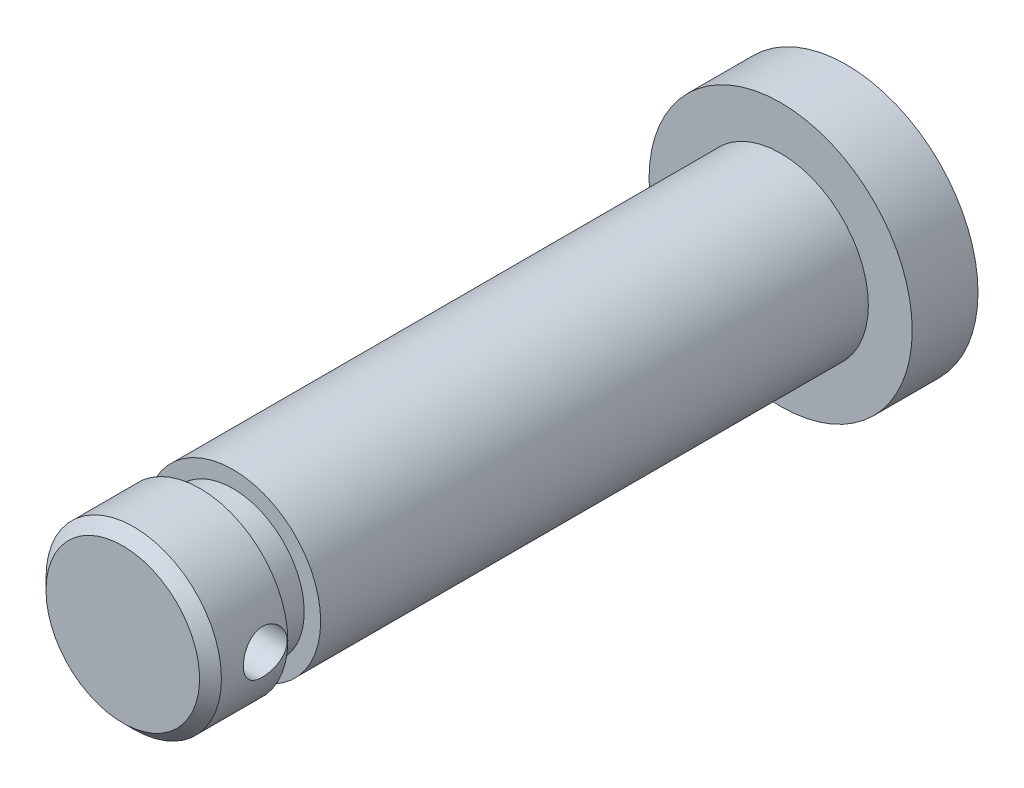
ISO-10303-21;
HEADER;
FILE_DESCRIPTION(('STEP AP214'),'2;1');
FILE_NAME('part.step','',(''),(''),'','','');
FILE_SCHEMA(('AUTOMOTIVE_DESIGN { 1 0 10303 214 1 1 1 1 }'));
ENDSEC;
DATA;
#1=APPLICATION_CONTEXT('core data for automotive mechanical design processes');
#2=APPLICATION_PROTOCOL_DEFINITION('international standard','automotive_design',2000,#1);
#3=PRODUCT_CONTEXT('',#1,'mechanical');
#4=PRODUCT('Part','Part','',(#3));
#5=PRODUCT_RELATED_PRODUCT_CATEGORY('part','',(#4));
#6=PRODUCT_DEFINITION_FORMATION('','',#4);
#7=PRODUCT_DEFINITION_CONTEXT('part definition',#1,'design');
#8=PRODUCT_DEFINITION('design','',#6,#7);
#9=PRODUCT_DEFINITION_SHAPE('','',#8);
#10=(LENGTH_UNIT() NAMED_UNIT(*) SI_UNIT(.MILLI.,.METRE.));
#11=(NAMED_UNIT(*) PLANE_ANGLE_UNIT() SI_UNIT($,.RADIAN.));
#12=(NAMED_UNIT(*) SI_UNIT($,.STERADIAN.) SOLID_ANGLE_UNIT());
#13=UNCERTAINTY_MEASURE_WITH_UNIT(LENGTH_MEASURE(1.E-05),#10,'distance_accuracy_value','');
#14=(GEOMETRIC_REPRESENTATION_CONTEXT(3) GLOBAL_UNCERTAINTY_ASSIGNED_CONTEXT((#13)) GLOBAL_UNIT_ASSIGNED_CONTEXT((#10,
#11,#12)) REPRESENTATION_CONTEXT('',''));
#15=CARTESIAN_POINT('',(0.,0.,0.));
#16=DIRECTION('',(0.,0.,1.));
#17=DIRECTION('',(1.,0.,0.));
#18=AXIS2_PLACEMENT_3D('',#15,#16,#17);
#19=CARTESIAN_POINT('',(0.,0.,0.));
#20=DIRECTION('',(0.,0.,-1.));
#21=DIRECTION('',(-1.,0.,0.));
#22=AXIS2_PLACEMENT_3D('',#19,#20,#21);
#23=CYLINDRICAL_SURFACE('',#22,8.);
#24=CARTESIAN_POINT('',(0.,0.,6.));
#25=DIRECTION('',(0.,0.,-1.));
#26=DIRECTION('',(-1.,0.,0.));
#27=AXIS2_PLACEMENT_3D('',#24,#25,#26);
#28=CIRCLE('',#27,8.);
#29=CARTESIAN_POINT('',(-8.,0.,6.));
#30=VERTEX_POINT('',#29);
#31=EDGE_CURVE('E67',#30,#30,#28,.T.);
#32=ORIENTED_EDGE('',*,*,#31,.F.);
#33=EDGE_LOOP('',(#32));
#34=FACE_BOUND('',#33,.T.);
#35=CARTESIAN_POINT('',(0.,0.,55.95));
#36=DIRECTION('',(0.,0.,1.));
#37=DIRECTION('',(1.,0.,0.));
#38=AXIS2_PLACEMENT_3D('',#35,#36,#37);
#39=CIRCLE('',#38,8.);
#40=CARTESIAN_POINT('',(8.,0.,55.95));
#41=VERTEX_POINT('',#40);
#42=EDGE_CURVE('E54',#41,#41,#39,.T.);
#43=ORIENTED_EDGE('',*,*,#42,.F.);
#44=EDGE_LOOP('',(#43));
#45=FACE_BOUND('',#44,.T.);
#46=ADVANCED_FACE('F49',(#34,#45),#23,.T.);
#47=CARTESIAN_POINT('',(0.,0.,0.));
#48=DIRECTION('',(0.,0.,1.));
#49=DIRECTION('',(1.,0.,0.));
#50=AXIS2_PLACEMENT_3D('',#47,#48,#49);
#51=PLANE('',#50);
#52=CARTESIAN_POINT('',(0.,0.,0.));
#53=DIRECTION('',(0.,0.,-1.));
#54=DIRECTION('',(-1.,0.,0.));
#55=AXIS2_PLACEMENT_3D('',#52,#53,#54);
#56=CIRCLE('',#55,12.);
#57=CARTESIAN_POINT('',(-12.,0.,0.));
#58=VERTEX_POINT('',#57);
#59=EDGE_CURVE('E10',#58,#58,#56,.T.);
#60=ORIENTED_EDGE('',*,*,#59,.T.);
#61=EDGE_LOOP('',(#60));
#62=FACE_BOUND('',#61,.T.);
#63=ADVANCED_FACE('F52',(#62),#51,.F.);
#64=CARTESIAN_POINT('',(0.,0.,0.));
#65=DIRECTION('',(0.,0.,-1.));
#66=DIRECTION('',(-1.,0.,0.));
#67=AXIS2_PLACEMENT_3D('',#64,#65,#66);
#68=CYLINDRICAL_SURFACE('',#67,12.);
#69=ORIENTED_EDGE('',*,*,#59,.F.);
#70=EDGE_LOOP('',(#69));
#71=FACE_BOUND('',#70,.T.);
#72=CARTESIAN_POINT('',(0.,0.,6.));
#73=DIRECTION('',(0.,0.,-1.));
#74=DIRECTION('',(-1.,0.,0.));
#75=AXIS2_PLACEMENT_3D('',#72,#73,#74);
#76=CIRCLE('',#75,12.);
#77=CARTESIAN_POINT('',(-12.,0.,6.));
#78=VERTEX_POINT('',#77);
#79=EDGE_CURVE('E59',#78,#78,#76,.T.);
#80=ORIENTED_EDGE('',*,*,#79,.T.);
#81=EDGE_LOOP('',(#80));
#82=FACE_BOUND('',#81,.T.);
#83=ADVANCED_FACE('F117',(#71,#82),#68,.T.);
#84=CARTESIAN_POINT('',(12.,0.,6.));
#85=DIRECTION('',(0.,0.,-1.));
#86=DIRECTION('',(-1.,0.,0.));
#87=AXIS2_PLACEMENT_3D('',#84,#85,#86);
#88=PLANE('',#87);
#89=ORIENTED_EDGE('',*,*,#79,.F.);
#90=EDGE_LOOP('',(#89));
#91=FACE_BOUND('',#90,.T.);
#92=ORIENTED_EDGE('',*,*,#31,.T.);
#93=EDGE_LOOP('',(#92));
#94=FACE_BOUND('',#93,.T.);
#95=ADVANCED_FACE('F149',(#91,#94),#88,.F.);
#96=CARTESIAN_POINT('',(6.5,0.,55.95));
#97=DIRECTION('',(0.,0.,1.));
#98=DIRECTION('',(1.,0.,0.));
#99=AXIS2_PLACEMENT_3D('',#96,#97,#98);
#100=PLANE('',#99);
#101=CARTESIAN_POINT('',(0.,0.,55.95));
#102=DIRECTION('',(0.,0.,-1.));
#103=DIRECTION('',(-1.,0.,0.));
#104=AXIS2_PLACEMENT_3D('',#101,#102,#103);
#105=CIRCLE('',#104,6.5);
#106=CARTESIAN_POINT('',(-6.5,0.,55.95));
#107=VERTEX_POINT('',#106);
#108=EDGE_CURVE('E129',#107,#107,#105,.T.);
#109=ORIENTED_EDGE('',*,*,#108,.T.);
#110=EDGE_LOOP('',(#109));
#111=FACE_BOUND('',#110,.T.);
#112=ORIENTED_EDGE('',*,*,#42,.T.);
#113=EDGE_LOOP('',(#112));
#114=FACE_BOUND('',#113,.T.);
#115=ADVANCED_FACE('F151',(#111,#114),#100,.T.);
#116=CARTESIAN_POINT('',(8.5,0.,58.95));
#117=DIRECTION('',(0.,0.,-1.));
#118=DIRECTION('',(-1.,0.,0.));
#119=AXIS2_PLACEMENT_3D('',#116,#117,#118);
#120=PLANE('',#119);
#121=CARTESIAN_POINT('',(0.,0.,58.95));
#122=DIRECTION('',(0.,0.,-1.));
#123=DIRECTION('',(-1.,0.,0.));
#124=AXIS2_PLACEMENT_3D('',#121,#122,#123);
#125=CIRCLE('',#124,6.5);
#126=CARTESIAN_POINT('',(-6.5,0.,58.95));
#127=VERTEX_POINT('',#126);
#128=EDGE_CURVE('E133',#127,#127,#125,.T.);
#129=ORIENTED_EDGE('',*,*,#128,.F.);
#130=EDGE_LOOP('',(#129));
#131=FACE_BOUND('',#130,.T.);
#132=CARTESIAN_POINT('',(0.,0.,58.95));
#133=DIRECTION('',(0.,0.,-1.));
#134=DIRECTION('',(-1.,0.,0.));
#135=AXIS2_PLACEMENT_3D('',#132,#133,#134);
#136=CIRCLE('',#135,8.);
#137=CARTESIAN_POINT('',(-8.,0.,58.95));
#138=VERTEX_POINT('',#137);
#139=EDGE_CURVE('E125',#138,#138,#136,.T.);
#140=ORIENTED_EDGE('',*,*,#139,.T.);
#141=EDGE_LOOP('',(#140));
#142=FACE_BOUND('',#141,.T.);
#143=ADVANCED_FACE('F156',(#131,#142),#120,.T.);
#144=CARTESIAN_POINT('',(0.,0.,0.));
#145=DIRECTION('',(0.,0.,-1.));
#146=DIRECTION('',(-1.,0.,0.));
#147=AXIS2_PLACEMENT_3D('',#144,#145,#146);
#148=CYLINDRICAL_SURFACE('',#147,6.5);
#149=ORIENTED_EDGE('',*,*,#128,.T.);
#150=EDGE_LOOP('',(#149));
#151=FACE_BOUND('',#150,.T.);
#152=ORIENTED_EDGE('',*,*,#108,.F.);
#153=EDGE_LOOP('',(#152));
#154=FACE_BOUND('',#153,.T.);
#155=ADVANCED_FACE('F100',(#151,#154),#148,.T.);
#156=CARTESIAN_POINT('',(7.,0.,66.));
#157=DIRECTION('',(0.,0.,-1.));
#158=DIRECTION('',(-1.,0.,0.));
#159=AXIS2_PLACEMENT_3D('',#156,#157,#158);
#160=PLANE('',#159);
#161=CARTESIAN_POINT('',(0.,0.,66.));
#162=DIRECTION('',(0.,0.,-1.));
#163=DIRECTION('',(-1.,0.,0.));
#164=AXIS2_PLACEMENT_3D('',#161,#162,#163);
#165=CIRCLE('',#164,7.);
#166=CARTESIAN_POINT('',(-7.,0.,66.));
#167=VERTEX_POINT('',#166);
#168=EDGE_CURVE('E140',#167,#167,#165,.T.);
#169=ORIENTED_EDGE('',*,*,#168,.F.);
#170=EDGE_LOOP('',(#169));
#171=FACE_BOUND('',#170,.T.);
#172=ADVANCED_FACE('F97',(#171),#160,.F.);
#173=CARTESIAN_POINT('',(-11.,0.,61.));
#174=DIRECTION('',(1.,0.,0.));
#175=DIRECTION('',(0.,0.,-1.));
#176=AXIS2_PLACEMENT_3D('',#173,#174,#175);
#177=CYLINDRICAL_SURFACE('',#176,2.);
#178=CARTESIAN_POINT('',(8.,0.,59.));
#179=CARTESIAN_POINT('',(7.9999981315735,-0.110501451559641,59.0000031009842));
#180=CARTESIAN_POINT('',(7.99768770842435,-0.22103754377435,59.009188734365));
#181=CARTESIAN_POINT('',(7.98869485106526,-0.438941765027376,59.045633535076));
#182=CARTESIAN_POINT('',(7.98200993893301,-0.54630806249432,59.0729029460505));
#183=CARTESIAN_POINT('',(7.96500835109376,-0.754694496243437,59.1445856712828));
#184=CARTESIAN_POINT('',(7.95469603789411,-0.855722084573337,59.188978398287));
#185=CARTESIAN_POINT('',(7.93153791743495,-1.04889617587257,59.2935751867264));
#186=CARTESIAN_POINT('',(7.91869202472209,-1.14104237913169,59.353779781492));
#187=CARTESIAN_POINT('',(7.89156551455591,-1.31573590306789,59.4896010528722));
#188=CARTESIAN_POINT('',(7.87726276197501,-1.39807425341475,59.5654820999454));
#189=CARTESIAN_POINT('',(7.84898160157248,-1.54899856960443,59.729936273212));
#190=CARTESIAN_POINT('',(7.83500323053157,-1.61758298259892,59.8185108305959));
#191=CARTESIAN_POINT('',(7.80873034264225,-1.74003539039863,60.007460302316));
#192=CARTESIAN_POINT('',(7.79646392619748,-1.79366962123352,60.1079909744116));
#193=CARTESIAN_POINT('',(7.77532659757355,-1.88319587806766,60.3169978822134));
#194=CARTESIAN_POINT('',(7.76645514259224,-1.91909074058686,60.4254728444427));
#195=CARTESIAN_POINT('',(7.7533396892843,-1.97140644907302,60.6449913309355));
#196=CARTESIAN_POINT('',(7.74900654662681,-1.98820302444274,60.755939861384));
#197=CARTESIAN_POINT('',(7.74519149946122,-2.00301570008855,60.9791580919991));
#198=CARTESIAN_POINT('',(7.74570880570571,-2.00103485575748,61.0914275742562));
#199=CARTESIAN_POINT('',(7.75145607355756,-1.97864869951961,61.3112210769938));
#200=CARTESIAN_POINT('',(7.75657150676391,-1.95869112025418,61.4187941619538));
#201=CARTESIAN_POINT('',(7.77075612894758,-1.90163224920399,61.6290147345481));
#202=CARTESIAN_POINT('',(7.77982559958985,-1.86452973609252,61.7316618707052));
#203=CARTESIAN_POINT('',(7.80100151874212,-1.77385263724958,61.9303173550028));
#204=CARTESIAN_POINT('',(7.81313769959755,-1.72011555631056,62.0262482290528));
#205=CARTESIAN_POINT('',(7.83906281127988,-1.59780836801993,62.2078916130091));
#206=CARTESIAN_POINT('',(7.85285203112837,-1.52923566507845,62.2936023307563));
#207=CARTESIAN_POINT('',(7.88101174053188,-1.37688456624163,62.4549381542592));
#208=CARTESIAN_POINT('',(7.89538759304001,-1.29272834422115,62.5302059867485));
#209=CARTESIAN_POINT('',(7.92274620771675,-1.11281589000494,62.6656283232852));
#210=CARTESIAN_POINT('',(7.93572892732543,-1.0170593036106,62.7257823656848));
#211=CARTESIAN_POINT('',(7.9589030945892,-0.816154518241862,62.8294007816325));
#212=CARTESIAN_POINT('',(7.96908480170303,-0.710975190944835,62.8728071203392));
#213=CARTESIAN_POINT('',(7.98543889321888,-0.494501344190511,62.9412230742794));
#214=CARTESIAN_POINT('',(7.99161204452374,-0.383207998867312,62.9662362085575));
#215=CARTESIAN_POINT('',(7.999139990285,-0.160719960520034,62.9966100874118));
#216=CARTESIAN_POINT('',(8.00061404677705,-0.0495956266509441,63.0024573681004));
#217=CARTESIAN_POINT('',(7.99891739752601,0.172043833068679,62.9956679972593));
#218=CARTESIAN_POINT('',(7.99574710989128,0.282559012859461,62.9830330096011));
#219=CARTESIAN_POINT('',(7.98519441503143,0.498152358368656,62.9400387888115));
#220=CARTESIAN_POINT('',(7.97787512247748,0.603286825291674,62.9099449820307));
#221=CARTESIAN_POINT('',(7.95984942178845,0.807009723270016,62.8331905546287));
#222=CARTESIAN_POINT('',(7.94914267159856,0.905597492043513,62.7865282609158));
#223=CARTESIAN_POINT('',(7.92524410568414,1.0953641792398,62.6770184948337));
#224=CARTESIAN_POINT('',(7.91201156489243,1.18638058911444,62.6138985168043));
#225=CARTESIAN_POINT('',(7.88459345583226,1.35670215152433,62.4736134549374));
#226=CARTESIAN_POINT('',(7.87040772335606,1.43600527863068,62.3964459471775));
#227=CARTESIAN_POINT('',(7.84225275947695,1.58265409076364,62.2279973855407));
#228=CARTESIAN_POINT('',(7.82829738916375,1.64965849016271,62.1364163959968));
#229=CARTESIAN_POINT('',(7.80257171169652,1.7673476786836,61.9430231540457));
#230=CARTESIAN_POINT('',(7.79080130756035,1.81803319221058,61.8412113560537));
#231=CARTESIAN_POINT('',(7.77090792979553,1.90126856081239,61.6307923701159));
#232=CARTESIAN_POINT('',(7.76276340389207,1.93392586220542,61.5222298288747));
#233=CARTESIAN_POINT('',(7.75102325453578,1.98046087993837,61.3009204828145));
#234=CARTESIAN_POINT('',(7.74742663626581,1.99434270330488,61.1881745986233));
#235=CARTESIAN_POINT('',(7.74526534938609,2.00271812044533,60.9651719681931));
#236=CARTESIAN_POINT('',(7.74655910304351,1.99775719704016,60.854936753167));
#237=CARTESIAN_POINT('',(7.7537054534379,1.96983637108382,60.6369281484427));
#238=CARTESIAN_POINT('',(7.75955795855809,1.94687683024903,60.5291547093151));
#239=CARTESIAN_POINT('',(7.77508347576963,1.88390842592373,60.3197220545795));
#240=CARTESIAN_POINT('',(7.78473353648412,1.84400187290717,60.2180302596797));
#241=CARTESIAN_POINT('',(7.80677007633105,1.7483532181401,60.0227128230484));
#242=CARTESIAN_POINT('',(7.81915693494364,1.69260892004559,59.9290883024174));
#243=CARTESIAN_POINT('',(7.84567512351349,1.56515699818285,59.7499271613306));
#244=CARTESIAN_POINT('',(7.85984353109009,1.49307088388301,59.6646652354347));
#245=CARTESIAN_POINT('',(7.88810702995047,1.33571916158632,59.5072706069395));
#246=CARTESIAN_POINT('',(7.90220210302746,1.25045042834819,59.435141026516));
#247=CARTESIAN_POINT('',(7.92903540863551,1.06729011560345,59.3047849219139));
#248=CARTESIAN_POINT('',(7.94174444487824,0.969197896421849,59.2468338484379));
#249=CARTESIAN_POINT('',(7.96406566633491,0.764354746013969,59.1483367160793));
#250=CARTESIAN_POINT('',(7.97368006933042,0.65761008458232,59.1077781858019));
#251=CARTESIAN_POINT('',(7.98730746087389,0.459213670991297,59.0512375595605));
#252=CARTESIAN_POINT('',(7.9920344673692,0.368506894544092,59.0320650092621));
#253=CARTESIAN_POINT('',(7.99838140309264,0.185208095381711,59.0064454085041));
#254=CARTESIAN_POINT('',(8.00000156601192,0.0926162149901553,58.9999974009263));
#255=CARTESIAN_POINT('',(8.,0.,59.));
#256=B_SPLINE_CURVE_WITH_KNOTS('',3,(#178,#179,#180,#181,#182,#183,#184,#185,#186,#187,#188,
#189,#190,#191,#192,#193,#194,#195,#196,#197,#198,#199,#200,#201,#202,#203,#204,#205,#206,#207,
#208,#209,#210,#211,#212,#213,#214,#215,#216,#217,#218,#219,#220,#221,#222,#223,#224,#225,#226,
#227,#228,#229,#230,#231,#232,#233,#234,#235,#236,#237,#238,#239,#240,#241,#242,#243,#244,#245,
#246,#247,#248,#249,#250,#251,#252,#253,#254,#255),.UNSPECIFIED.,.T.,.F.,(4,2,2,2,2,2,2,2,2,2,2,
2,2,2,2,2,2,2,2,2,2,2,2,2,2,2,2,2,2,2,2,2,2,2,2,2,2,2,4),(0.,0.331164949962519,
0.662517650351866,0.993473203048142,1.32443992022577,1.66152580582853,1.99864972773416,
2.34078196727742,2.68285948225824,3.01808393468094,3.35325384154691,3.68029996013786,
4.00736937959146,4.337740371696,4.66816921119312,5.00802001296453,5.34788119415423,
5.6889097201658,6.02987298255952,6.36211078603463,6.69431868154752,7.02160366023145,
7.34892169767482,7.68204783424897,8.01523150681786,8.35659345610396,8.69794025003772,
9.03723006156477,9.37644564340972,9.70591707202578,10.0353818794581,10.3628853408369,
10.6904342418696,11.0265276855098,11.3627009303165,11.7049624733721,12.0469781843289,
12.3245632392729,12.6021274139515),.UNSPECIFIED.);
#257=CARTESIAN_POINT('',(8.,0.,59.));
#258=VERTEX_POINT('',#257);
#259=EDGE_CURVE('E71',#258,#258,#256,.T.);
#260=ORIENTED_EDGE('',*,*,#259,.F.);
#261=EDGE_LOOP('',(#260));
#262=FACE_BOUND('',#261,.T.);
#263=CARTESIAN_POINT('',(-8.,0.,63.));
#264=CARTESIAN_POINT('',(-7.9999981315735,-0.110501451559642,62.9999968990158));
#265=CARTESIAN_POINT('',(-7.99768770842435,-0.221037543774353,62.990811265635));
#266=CARTESIAN_POINT('',(-7.98869485106526,-0.438941765027379,62.954366464924));
#267=CARTESIAN_POINT('',(-7.98200993893301,-0.546308062494321,62.9270970539495));
#268=CARTESIAN_POINT('',(-7.96500835109376,-0.754694496243439,62.8554143287172));
#269=CARTESIAN_POINT('',(-7.95469603789411,-0.855722084573343,62.811021601713));
#270=CARTESIAN_POINT('',(-7.93153791743495,-1.04889617587258,62.7064248132735));
#271=CARTESIAN_POINT('',(-7.91869202472208,-1.14104237913169,62.646220218508));
#272=CARTESIAN_POINT('',(-7.89156551455591,-1.31573590306789,62.5103989471278));
#273=CARTESIAN_POINT('',(-7.87726276197502,-1.39807425341474,62.4345179000546));
#274=CARTESIAN_POINT('',(-7.84898160157248,-1.54899856960443,62.270063726788));
#275=CARTESIAN_POINT('',(-7.83500323053157,-1.61758298259892,62.1814891694041));
#276=CARTESIAN_POINT('',(-7.80873034264225,-1.74003539039863,61.992539697684));
#277=CARTESIAN_POINT('',(-7.79646392619748,-1.79366962123352,61.8920090255884));
#278=CARTESIAN_POINT('',(-7.77532659757355,-1.88319587806766,61.6830021177866));
#279=CARTESIAN_POINT('',(-7.76645514259224,-1.91909074058686,61.5745271555573));
#280=CARTESIAN_POINT('',(-7.7533396892843,-1.97140644907302,61.3550086690645));
#281=CARTESIAN_POINT('',(-7.74900654662681,-1.98820302444274,61.244060138616));
#282=CARTESIAN_POINT('',(-7.74519149946122,-2.00301570008855,61.0208419080009));
#283=CARTESIAN_POINT('',(-7.74570880570571,-2.00103485575748,60.9085724257438));
#284=CARTESIAN_POINT('',(-7.75145607355756,-1.97864869951961,60.6887789230062));
#285=CARTESIAN_POINT('',(-7.75657150676391,-1.95869112025418,60.5812058380462));
#286=CARTESIAN_POINT('',(-7.77075612894758,-1.90163224920399,60.3709852654519));
#287=CARTESIAN_POINT('',(-7.77982559958985,-1.86452973609252,60.2683381292948));
#288=CARTESIAN_POINT('',(-7.80100151874212,-1.77385263724958,60.0696826449972));
#289=CARTESIAN_POINT('',(-7.81313769959755,-1.72011555631056,59.9737517709472));
#290=CARTESIAN_POINT('',(-7.83906281127988,-1.59780836801993,59.7921083869909));
#291=CARTESIAN_POINT('',(-7.85285203112837,-1.52923566507845,59.7063976692437));
#292=CARTESIAN_POINT('',(-7.88101174053188,-1.37688456624162,59.5450618457408));
#293=CARTESIAN_POINT('',(-7.89538759304001,-1.29272834422114,59.4697940132515));
#294=CARTESIAN_POINT('',(-7.92274620771675,-1.11281589000493,59.3343716767148));
#295=CARTESIAN_POINT('',(-7.93572892732543,-1.01705930361058,59.2742176343152));
#296=CARTESIAN_POINT('',(-7.9589030945892,-0.816154518241849,59.1705992183675));
#297=CARTESIAN_POINT('',(-7.96908480170303,-0.710975190944825,59.1271928796608));
#298=CARTESIAN_POINT('',(-7.98543889321888,-0.494501344190504,59.0587769257206));
#299=CARTESIAN_POINT('',(-7.99161204452374,-0.383207998867306,59.0337637914425));
#300=CARTESIAN_POINT('',(-7.999139990285,-0.160719960520029,59.0033899125882));
#301=CARTESIAN_POINT('',(-8.00061404677705,-0.0495956266509403,58.9975426318996));
#302=CARTESIAN_POINT('',(-7.99891739752601,0.172043833068683,59.0043320027406));
#303=CARTESIAN_POINT('',(-7.99574710989128,0.282559012859466,59.0169669903988));
#304=CARTESIAN_POINT('',(-7.98519441503143,0.49815235836866,59.0599612111885));
#305=CARTESIAN_POINT('',(-7.97787512247748,0.603286825291676,59.0900550179693));
#306=CARTESIAN_POINT('',(-7.95984942178845,0.807009723270019,59.1668094453713));
#307=CARTESIAN_POINT('',(-7.94914267159856,0.905597492043518,59.2134717390842));
#308=CARTESIAN_POINT('',(-7.92524410568414,1.0953641792398,59.3229815051663));
#309=CARTESIAN_POINT('',(-7.91201156489243,1.18638058911445,59.3861014831957));
#310=CARTESIAN_POINT('',(-7.88459345583225,1.35670215152433,59.5263865450626));
#311=CARTESIAN_POINT('',(-7.87040772335606,1.43600527863068,59.6035540528225));
#312=CARTESIAN_POINT('',(-7.84225275947695,1.58265409076365,59.7720026144593));
#313=CARTESIAN_POINT('',(-7.82829738916375,1.64965849016271,59.8635836040032));
#314=CARTESIAN_POINT('',(-7.80257171169651,1.7673476786836,60.0569768459543));
#315=CARTESIAN_POINT('',(-7.79080130756035,1.81803319221059,60.1587886439463));
#316=CARTESIAN_POINT('',(-7.77090792979553,1.90126856081239,60.3692076298841));
#317=CARTESIAN_POINT('',(-7.76276340389207,1.93392586220542,60.4777701711253));
#318=CARTESIAN_POINT('',(-7.75102325453578,1.98046087993837,60.6990795171855));
#319=CARTESIAN_POINT('',(-7.74742663626581,1.99434270330488,60.8118254013767));
#320=CARTESIAN_POINT('',(-7.74526534938609,2.00271812044533,61.0348280318069));
#321=CARTESIAN_POINT('',(-7.74655910304351,1.99775719704016,61.145063246833));
#322=CARTESIAN_POINT('',(-7.7537054534379,1.96983637108382,61.3630718515573));
#323=CARTESIAN_POINT('',(-7.75955795855809,1.94687683024903,61.4708452906849));
#324=CARTESIAN_POINT('',(-7.77508347576963,1.88390842592372,61.6802779454206));
#325=CARTESIAN_POINT('',(-7.78473353648412,1.84400187290717,61.7819697403203));
#326=CARTESIAN_POINT('',(-7.80677007633105,1.74835321814009,61.9772871769516));
#327=CARTESIAN_POINT('',(-7.81915693494364,1.69260892004558,62.0709116975826));
#328=CARTESIAN_POINT('',(-7.84567512351349,1.56515699818285,62.2500728386694));
#329=CARTESIAN_POINT('',(-7.85984353109009,1.49307088388301,62.3353347645653));
#330=CARTESIAN_POINT('',(-7.88810702995047,1.33571916158632,62.4927293930605));
#331=CARTESIAN_POINT('',(-7.90220210302746,1.25045042834819,62.564858973484));
#332=CARTESIAN_POINT('',(-7.92903540863551,1.06729011560345,62.6952150780862));
#333=CARTESIAN_POINT('',(-7.94174444487824,0.969197896421852,62.7531661515621));
#334=CARTESIAN_POINT('',(-7.96406566633491,0.764354746013972,62.8516632839207));
#335=CARTESIAN_POINT('',(-7.97368006933042,0.65761008458232,62.8922218141981));
#336=CARTESIAN_POINT('',(-7.98730746087389,0.459213670991294,62.9487624404395));
#337=CARTESIAN_POINT('',(-7.9920344673692,0.36850689454409,62.9679349907379));
#338=CARTESIAN_POINT('',(-7.99838140309264,0.185208095381711,62.9935545914959));
#339=CARTESIAN_POINT('',(-8.00000156601192,0.092616214990155,63.0000025990737));
#340=CARTESIAN_POINT('',(-8.,0.,63.));
#341=B_SPLINE_CURVE_WITH_KNOTS('',3,(#263,#264,#265,#266,#267,#268,#269,#270,#271,#272,#273,
#274,#275,#276,#277,#278,#279,#280,#281,#282,#283,#284,#285,#286,#287,#288,#289,#290,#291,#292,
#293,#294,#295,#296,#297,#298,#299,#300,#301,#302,#303,#304,#305,#306,#307,#308,#309,#310,#311,
#312,#313,#314,#315,#316,#317,#318,#319,#320,#321,#322,#323,#324,#325,#326,#327,#328,#329,#330,
#331,#332,#333,#334,#335,#336,#337,#338,#339,#340),.UNSPECIFIED.,.T.,.F.,(4,2,2,2,2,2,2,2,2,2,2,
2,2,2,2,2,2,2,2,2,2,2,2,2,2,2,2,2,2,2,2,2,2,2,2,2,2,2,4),(0.,0.331164949962521,
0.662517650351869,0.993473203048147,1.32443992022577,1.66152580582852,1.99864972773416,
2.34078196727742,2.68285948225824,3.01808393468094,3.35325384154692,3.68029996013787,
4.00736937959146,4.337740371696,4.66816921119312,5.00802001296455,5.34788119415425,
5.68890972016581,6.02987298255953,6.36211078603464,6.69431868154752,7.02160366023145,
7.34892169767483,7.68204783424899,8.01523150681787,8.35659345610397,8.69794025003773,
9.03723006156477,9.37644564340973,9.70591707202578,10.0353818794581,10.3628853408369,
10.6904342418696,11.0265276855098,11.3627009303165,11.7049624733721,12.046978184329,
12.3245632392729,12.6021274139515),.UNSPECIFIED.);
#342=CARTESIAN_POINT('',(-8.,0.,63.));
#343=VERTEX_POINT('',#342);
#344=EDGE_CURVE('E80',#343,#343,#341,.T.);
#345=ORIENTED_EDGE('',*,*,#344,.F.);
#346=EDGE_LOOP('',(#345));
#347=FACE_BOUND('',#346,.T.);
#348=ADVANCED_FACE('F89',(#262,#347),#177,.F.);
#349=CARTESIAN_POINT('',(0.,0.,66.));
#350=DIRECTION('',(0.,0.,-1.));
#351=DIRECTION('',(-1.,0.,0.));
#352=AXIS2_PLACEMENT_3D('',#349,#350,#351);
#353=CONICAL_SURFACE('',#352,7.,0.785398163397448);
#354=CARTESIAN_POINT('',(0.,0.,65.));
#355=DIRECTION('',(0.,0.,-1.));
#356=DIRECTION('',(-1.,0.,0.));
#357=AXIS2_PLACEMENT_3D('',#354,#355,#356);
#358=CIRCLE('',#357,8.);
#359=CARTESIAN_POINT('',(-8.,0.,65.));
#360=VERTEX_POINT('',#359);
#361=EDGE_CURVE('E144',#360,#360,#358,.T.);
#362=ORIENTED_EDGE('',*,*,#361,.F.);
#363=EDGE_LOOP('',(#362));
#364=FACE_BOUND('',#363,.T.);
#365=ORIENTED_EDGE('',*,*,#168,.T.);
#366=EDGE_LOOP('',(#365));
#367=FACE_BOUND('',#366,.T.);
#368=ADVANCED_FACE('F96',(#364,#367),#353,.T.);
#369=ORIENTED_EDGE('',*,*,#361,.T.);
#370=EDGE_LOOP('',(#369));
#371=FACE_BOUND('',#370,.T.);
#372=ORIENTED_EDGE('',*,*,#259,.T.);
#373=EDGE_LOOP('',(#372));
#374=FACE_BOUND('',#373,.T.);
#375=ORIENTED_EDGE('',*,*,#344,.T.);
#376=EDGE_LOOP('',(#375));
#377=FACE_BOUND('',#376,.T.);
#378=ORIENTED_EDGE('',*,*,#139,.F.);
#379=EDGE_LOOP('',(#378));
#380=FACE_BOUND('',#379,.T.);
#381=ADVANCED_FACE('F106',(#371,#374,#377,#380),#23,.T.);
#382=CLOSED_SHELL('',(#46,#63,#83,#95,#115,#143,#155,#172,#348,#368,#381));
#383=MANIFOLD_SOLID_BREP('B2',#382);
#384=ADVANCED_BREP_SHAPE_REPRESENTATION('',(#18,#383),#14);
#385=SHAPE_DEFINITION_REPRESENTATION(#9,#384);
ENDSEC;
END-ISO-10303-21;
